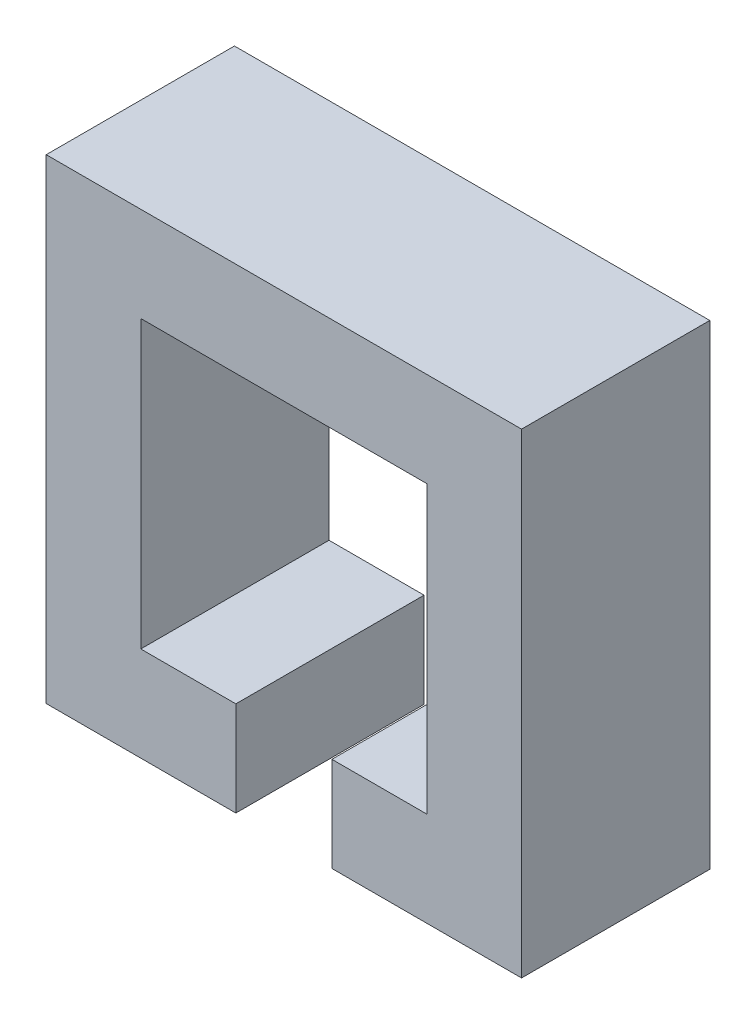
ISO-10303-21;
HEADER;
FILE_DESCRIPTION(('STEP AP214'),'2;1');
FILE_NAME('part.step','',(''),(''),'','','');
FILE_SCHEMA(('AUTOMOTIVE_DESIGN { 1 0 10303 214 1 1 1 1 }'));
ENDSEC;
DATA;
#1=APPLICATION_CONTEXT('core data for automotive mechanical design processes');
#2=APPLICATION_PROTOCOL_DEFINITION('international standard','automotive_design',2000,#1);
#3=PRODUCT_CONTEXT('',#1,'mechanical');
#4=PRODUCT('Part','Part','',(#3));
#5=PRODUCT_RELATED_PRODUCT_CATEGORY('part','',(#4));
#6=PRODUCT_DEFINITION_FORMATION('','',#4);
#7=PRODUCT_DEFINITION_CONTEXT('part definition',#1,'design');
#8=PRODUCT_DEFINITION('design','',#6,#7);
#9=PRODUCT_DEFINITION_SHAPE('','',#8);
#10=(LENGTH_UNIT() NAMED_UNIT(*) SI_UNIT(.MILLI.,.METRE.));
#11=(NAMED_UNIT(*) PLANE_ANGLE_UNIT() SI_UNIT($,.RADIAN.));
#12=(NAMED_UNIT(*) SI_UNIT($,.STERADIAN.) SOLID_ANGLE_UNIT());
#13=UNCERTAINTY_MEASURE_WITH_UNIT(LENGTH_MEASURE(1.E-05),#10,'distance_accuracy_value','');
#14=(GEOMETRIC_REPRESENTATION_CONTEXT(3) GLOBAL_UNCERTAINTY_ASSIGNED_CONTEXT((#13)) GLOBAL_UNIT_ASSIGNED_CONTEXT((#10,
#11,#12)) REPRESENTATION_CONTEXT('',''));
#15=CARTESIAN_POINT('',(0.,0.,0.));
#16=DIRECTION('',(0.,0.,1.));
#17=DIRECTION('',(1.,0.,0.));
#18=AXIS2_PLACEMENT_3D('',#15,#16,#17);
#19=CARTESIAN_POINT('',(-2.5259998716265,-25.0259988006056,0.));
#20=DIRECTION('',(0.,1.,0.));
#21=DIRECTION('',(0.,0.,1.));
#22=AXIS2_PLACEMENT_3D('',#19,#20,#21);
#23=PLANE('',#22);
#24=DIRECTION('',(-1.,0.,0.));
#25=VECTOR('',#24,1.);
#26=CARTESIAN_POINT('',(-2.5259998716265,-25.0259988006056,9.89999994635582));
#27=LINE('',#26,#25);
#28=CARTESIAN_POINT('',(-2.5259998716265,-25.0259988006056,9.89999994635582));
#29=VERTEX_POINT('',#28);
#30=CARTESIAN_POINT('',(-7.52599991819263,-25.0259988006056,9.89999994635582));
#31=VERTEX_POINT('',#30);
#32=EDGE_CURVE('E170',#29,#31,#27,.T.);
#33=ORIENTED_EDGE('',*,*,#32,.F.);
#34=DIRECTION('',(0.,0.,1.));
#35=VECTOR('',#34,1.);
#36=CARTESIAN_POINT('',(-2.5259998716265,-25.0259988006056,0.));
#37=LINE('',#36,#35);
#38=CARTESIAN_POINT('',(-2.5259998716265,-25.0259988006056,0.));
#39=VERTEX_POINT('',#38);
#40=EDGE_CURVE('E11',#39,#29,#37,.T.);
#41=ORIENTED_EDGE('',*,*,#40,.F.);
#42=DIRECTION('',(-1.,0.,0.));
#43=VECTOR('',#42,1.);
#44=CARTESIAN_POINT('',(-2.5259998716265,-25.0259988006056,0.));
#45=LINE('',#44,#43);
#46=CARTESIAN_POINT('',(-7.52599991819263,-25.0259988006056,0.));
#47=VERTEX_POINT('',#46);
#48=EDGE_CURVE('E214',#39,#47,#45,.T.);
#49=ORIENTED_EDGE('',*,*,#48,.T.);
#50=DIRECTION('',(0.,0.,1.));
#51=VECTOR('',#50,1.);
#52=CARTESIAN_POINT('',(-7.52599991819263,-25.0259988006056,0.));
#53=LINE('',#52,#51);
#54=EDGE_CURVE('E46',#47,#31,#53,.T.);
#55=ORIENTED_EDGE('',*,*,#54,.T.);
#56=EDGE_LOOP('',(#33,#41,#49,#55));
#57=FACE_BOUND('',#56,.T.);
#58=ADVANCED_FACE('F43',(#57),#23,.T.);
#59=CARTESIAN_POINT('',(-2.5259998716265,-29.9999988824129,0.));
#60=DIRECTION('',(1.,0.,0.));
#61=DIRECTION('',(0.,0.,-1.));
#62=AXIS2_PLACEMENT_3D('',#59,#60,#61);
#63=PLANE('',#62);
#64=DIRECTION('',(0.,1.,0.));
#65=VECTOR('',#64,1.);
#66=CARTESIAN_POINT('',(-2.5259998716265,-29.9999988824129,9.89999994635582));
#67=LINE('',#66,#65);
#68=CARTESIAN_POINT('',(-2.5259998716265,-29.9999988824129,9.89999994635582));
#69=VERTEX_POINT('',#68);
#70=EDGE_CURVE('E211',#69,#29,#67,.T.);
#71=ORIENTED_EDGE('',*,*,#70,.F.);
#72=DIRECTION('',(0.,0.,1.));
#73=VECTOR('',#72,1.);
#74=CARTESIAN_POINT('',(-2.5259998716265,-29.9999988824129,0.));
#75=LINE('',#74,#73);
#76=CARTESIAN_POINT('',(-2.5259998716265,-29.9999988824129,0.));
#77=VERTEX_POINT('',#76);
#78=EDGE_CURVE('E53',#77,#69,#75,.T.);
#79=ORIENTED_EDGE('',*,*,#78,.F.);
#80=DIRECTION('',(0.,1.,0.));
#81=VECTOR('',#80,1.);
#82=CARTESIAN_POINT('',(-2.5259998716265,-29.9999988824129,0.));
#83=LINE('',#82,#81);
#84=EDGE_CURVE('E156',#77,#39,#83,.T.);
#85=ORIENTED_EDGE('',*,*,#84,.T.);
#86=ORIENTED_EDGE('',*,*,#40,.T.);
#87=EDGE_LOOP('',(#71,#79,#85,#86));
#88=FACE_BOUND('',#87,.T.);
#89=ADVANCED_FACE('F244',(#88),#63,.T.);
#90=CARTESIAN_POINT('',(-12.5,-29.9999988824129,0.));
#91=DIRECTION('',(0.,-1.,0.));
#92=DIRECTION('',(0.,0.,-1.));
#93=AXIS2_PLACEMENT_3D('',#90,#91,#92);
#94=PLANE('',#93);
#95=DIRECTION('',(1.,0.,0.));
#96=VECTOR('',#95,1.);
#97=CARTESIAN_POINT('',(-12.5,-29.9999988824129,9.89999994635582));
#98=LINE('',#97,#96);
#99=CARTESIAN_POINT('',(-12.5,-29.9999988824129,9.89999994635582));
#100=VERTEX_POINT('',#99);
#101=EDGE_CURVE('E142',#100,#69,#98,.T.);
#102=ORIENTED_EDGE('',*,*,#101,.F.);
#103=DIRECTION('',(0.,0.,1.));
#104=VECTOR('',#103,1.);
#105=CARTESIAN_POINT('',(-12.5,-29.9999988824129,0.));
#106=LINE('',#105,#104);
#107=CARTESIAN_POINT('',(-12.5,-29.9999988824129,0.));
#108=VERTEX_POINT('',#107);
#109=EDGE_CURVE('E137',#108,#100,#106,.T.);
#110=ORIENTED_EDGE('',*,*,#109,.F.);
#111=DIRECTION('',(1.,0.,0.));
#112=VECTOR('',#111,1.);
#113=CARTESIAN_POINT('',(-12.5,-29.9999988824129,0.));
#114=LINE('',#113,#112);
#115=EDGE_CURVE('E140',#108,#77,#114,.T.);
#116=ORIENTED_EDGE('',*,*,#115,.T.);
#117=ORIENTED_EDGE('',*,*,#78,.T.);
#118=EDGE_LOOP('',(#102,#110,#116,#117));
#119=FACE_BOUND('',#118,.T.);
#120=ADVANCED_FACE('F139',(#119),#94,.T.);
#121=CARTESIAN_POINT('',(-12.5,-4.99999981373549,0.));
#122=DIRECTION('',(-1.,0.,0.));
#123=DIRECTION('',(0.,0.,1.));
#124=AXIS2_PLACEMENT_3D('',#121,#122,#123);
#125=PLANE('',#124);
#126=DIRECTION('',(0.,-1.,0.));
#127=VECTOR('',#126,1.);
#128=CARTESIAN_POINT('',(-12.5,-4.99999981373549,9.89999994635582));
#129=LINE('',#128,#127);
#130=CARTESIAN_POINT('',(-12.5,-4.99999981373549,9.89999994635582));
#131=VERTEX_POINT('',#130);
#132=EDGE_CURVE('E206',#131,#100,#129,.T.);
#133=ORIENTED_EDGE('',*,*,#132,.F.);
#134=DIRECTION('',(0.,0.,1.));
#135=VECTOR('',#134,1.);
#136=CARTESIAN_POINT('',(-12.5,-4.99999981373549,0.));
#137=LINE('',#136,#135);
#138=CARTESIAN_POINT('',(-12.5,-4.99999981373549,0.));
#139=VERTEX_POINT('',#138);
#140=EDGE_CURVE('E148',#139,#131,#137,.T.);
#141=ORIENTED_EDGE('',*,*,#140,.F.);
#142=DIRECTION('',(0.,-1.,0.));
#143=VECTOR('',#142,1.);
#144=CARTESIAN_POINT('',(-12.5,-4.99999981373549,0.));
#145=LINE('',#144,#143);
#146=EDGE_CURVE('E154',#139,#108,#145,.T.);
#147=ORIENTED_EDGE('',*,*,#146,.T.);
#148=ORIENTED_EDGE('',*,*,#109,.T.);
#149=EDGE_LOOP('',(#133,#141,#147,#148));
#150=FACE_BOUND('',#149,.T.);
#151=ADVANCED_FACE('F159',(#150),#125,.T.);
#152=CARTESIAN_POINT('',(12.5,-4.99999981373549,0.));
#153=DIRECTION('',(0.,1.,0.));
#154=DIRECTION('',(0.,0.,1.));
#155=AXIS2_PLACEMENT_3D('',#152,#153,#154);
#156=PLANE('',#155);
#157=DIRECTION('',(-1.,0.,0.));
#158=VECTOR('',#157,1.);
#159=CARTESIAN_POINT('',(12.5,-4.99999981373549,9.89999994635582));
#160=LINE('',#159,#158);
#161=CARTESIAN_POINT('',(12.5,-4.99999981373549,9.89999994635582));
#162=VERTEX_POINT('',#161);
#163=EDGE_CURVE('E202',#162,#131,#160,.T.);
#164=ORIENTED_EDGE('',*,*,#163,.F.);
#165=DIRECTION('',(0.,0.,1.));
#166=VECTOR('',#165,1.);
#167=CARTESIAN_POINT('',(12.5,-4.99999981373549,0.));
#168=LINE('',#167,#166);
#169=CARTESIAN_POINT('',(12.5,-4.99999981373549,0.));
#170=VERTEX_POINT('',#169);
#171=EDGE_CURVE('E220',#170,#162,#168,.T.);
#172=ORIENTED_EDGE('',*,*,#171,.F.);
#173=DIRECTION('',(-1.,0.,0.));
#174=VECTOR('',#173,1.);
#175=CARTESIAN_POINT('',(12.5,-4.99999981373549,0.));
#176=LINE('',#175,#174);
#177=EDGE_CURVE('E161',#170,#139,#176,.T.);
#178=ORIENTED_EDGE('',*,*,#177,.T.);
#179=ORIENTED_EDGE('',*,*,#140,.T.);
#180=EDGE_LOOP('',(#164,#172,#178,#179));
#181=FACE_BOUND('',#180,.T.);
#182=ADVANCED_FACE('F257',(#181),#156,.T.);
#183=CARTESIAN_POINT('',(12.5,-29.9999988824129,0.));
#184=DIRECTION('',(1.,0.,0.));
#185=DIRECTION('',(0.,0.,-1.));
#186=AXIS2_PLACEMENT_3D('',#183,#184,#185);
#187=PLANE('',#186);
#188=DIRECTION('',(0.,1.,0.));
#189=VECTOR('',#188,1.);
#190=CARTESIAN_POINT('',(12.5,-29.9999988824129,9.89999994635582));
#191=LINE('',#190,#189);
#192=CARTESIAN_POINT('',(12.5,-29.9999988824129,9.89999994635582));
#193=VERTEX_POINT('',#192);
#194=EDGE_CURVE('E198',#193,#162,#191,.T.);
#195=ORIENTED_EDGE('',*,*,#194,.F.);
#196=DIRECTION('',(0.,0.,1.));
#197=VECTOR('',#196,1.);
#198=CARTESIAN_POINT('',(12.5,-29.9999988824129,0.));
#199=LINE('',#198,#197);
#200=CARTESIAN_POINT('',(12.5,-29.9999988824129,0.));
#201=VERTEX_POINT('',#200);
#202=EDGE_CURVE('E223',#201,#193,#199,.T.);
#203=ORIENTED_EDGE('',*,*,#202,.F.);
#204=DIRECTION('',(0.,1.,0.));
#205=VECTOR('',#204,1.);
#206=CARTESIAN_POINT('',(12.5,-29.9999988824129,0.));
#207=LINE('',#206,#205);
#208=EDGE_CURVE('E164',#201,#170,#207,.T.);
#209=ORIENTED_EDGE('',*,*,#208,.T.);
#210=ORIENTED_EDGE('',*,*,#171,.T.);
#211=EDGE_LOOP('',(#195,#203,#209,#210));
#212=FACE_BOUND('',#211,.T.);
#213=ADVANCED_FACE('F260',(#212),#187,.T.);
#214=CARTESIAN_POINT('',(2.52649999184161,-29.9999988824129,0.));
#215=DIRECTION('',(0.,-1.,0.));
#216=DIRECTION('',(0.,0.,-1.));
#217=AXIS2_PLACEMENT_3D('',#214,#215,#216);
#218=PLANE('',#217);
#219=DIRECTION('',(1.,0.,0.));
#220=VECTOR('',#219,1.);
#221=CARTESIAN_POINT('',(2.52649999184161,-29.9999988824129,9.89999994635582));
#222=LINE('',#221,#220);
#223=CARTESIAN_POINT('',(2.52649999184161,-29.9999988824129,9.89999994635582));
#224=VERTEX_POINT('',#223);
#225=EDGE_CURVE('E194',#224,#193,#222,.T.);
#226=ORIENTED_EDGE('',*,*,#225,.F.);
#227=DIRECTION('',(0.,0.,1.));
#228=VECTOR('',#227,1.);
#229=CARTESIAN_POINT('',(2.52649999184161,-29.9999988824129,0.));
#230=LINE('',#229,#228);
#231=CARTESIAN_POINT('',(2.52649999184161,-29.9999988824129,0.));
#232=VERTEX_POINT('',#231);
#233=EDGE_CURVE('E226',#232,#224,#230,.T.);
#234=ORIENTED_EDGE('',*,*,#233,.F.);
#235=DIRECTION('',(1.,0.,0.));
#236=VECTOR('',#235,1.);
#237=CARTESIAN_POINT('',(2.52649999184161,-29.9999988824129,0.));
#238=LINE('',#237,#236);
#239=EDGE_CURVE('E414',#232,#201,#238,.T.);
#240=ORIENTED_EDGE('',*,*,#239,.T.);
#241=ORIENTED_EDGE('',*,*,#202,.T.);
#242=EDGE_LOOP('',(#226,#234,#240,#241));
#243=FACE_BOUND('',#242,.T.);
#244=ADVANCED_FACE('F264',(#243),#218,.T.);
#245=CARTESIAN_POINT('',(2.52649999184161,-25.0259988006056,0.));
#246=DIRECTION('',(-1.,0.,0.));
#247=DIRECTION('',(0.,0.,1.));
#248=AXIS2_PLACEMENT_3D('',#245,#246,#247);
#249=PLANE('',#248);
#250=DIRECTION('',(0.,-1.,0.));
#251=VECTOR('',#250,1.);
#252=CARTESIAN_POINT('',(2.52649999184161,-25.0259988006056,9.89999994635582));
#253=LINE('',#252,#251);
#254=CARTESIAN_POINT('',(2.52649999184161,-25.0259988006056,9.89999994635582));
#255=VERTEX_POINT('',#254);
#256=EDGE_CURVE('E190',#255,#224,#253,.T.);
#257=ORIENTED_EDGE('',*,*,#256,.F.);
#258=DIRECTION('',(0.,0.,1.));
#259=VECTOR('',#258,1.);
#260=CARTESIAN_POINT('',(2.52649999184161,-25.0259988006056,0.));
#261=LINE('',#260,#259);
#262=CARTESIAN_POINT('',(2.52649999184161,-25.0259988006056,0.));
#263=VERTEX_POINT('',#262);
#264=EDGE_CURVE('E229',#263,#255,#261,.T.);
#265=ORIENTED_EDGE('',*,*,#264,.F.);
#266=DIRECTION('',(0.,-1.,0.));
#267=VECTOR('',#266,1.);
#268=CARTESIAN_POINT('',(2.52649999184161,-25.0259988006056,0.));
#269=LINE('',#268,#267);
#270=EDGE_CURVE('E420',#263,#232,#269,.T.);
#271=ORIENTED_EDGE('',*,*,#270,.T.);
#272=ORIENTED_EDGE('',*,*,#233,.T.);
#273=EDGE_LOOP('',(#257,#265,#271,#272));
#274=FACE_BOUND('',#273,.T.);
#275=ADVANCED_FACE('F268',(#274),#249,.T.);
#276=CARTESIAN_POINT('',(7.52650003840774,-25.0259988006056,0.));
#277=DIRECTION('',(0.,1.,0.));
#278=DIRECTION('',(0.,0.,1.));
#279=AXIS2_PLACEMENT_3D('',#276,#277,#278);
#280=PLANE('',#279);
#281=DIRECTION('',(-1.,0.,0.));
#282=VECTOR('',#281,1.);
#283=CARTESIAN_POINT('',(7.52650003840774,-25.0259988006056,9.89999994635582));
#284=LINE('',#283,#282);
#285=CARTESIAN_POINT('',(7.52650003840774,-25.0259988006056,9.89999994635582));
#286=VERTEX_POINT('',#285);
#287=EDGE_CURVE('E186',#286,#255,#284,.T.);
#288=ORIENTED_EDGE('',*,*,#287,.F.);
#289=DIRECTION('',(0.,0.,1.));
#290=VECTOR('',#289,1.);
#291=CARTESIAN_POINT('',(7.52650003840774,-25.0259988006056,0.));
#292=LINE('',#291,#290);
#293=CARTESIAN_POINT('',(7.52650003840774,-25.0259988006056,0.));
#294=VERTEX_POINT('',#293);
#295=EDGE_CURVE('E232',#294,#286,#292,.T.);
#296=ORIENTED_EDGE('',*,*,#295,.F.);
#297=DIRECTION('',(-1.,0.,0.));
#298=VECTOR('',#297,1.);
#299=CARTESIAN_POINT('',(7.52650003840774,-25.0259988006056,0.));
#300=LINE('',#299,#298);
#301=EDGE_CURVE('E407',#294,#263,#300,.T.);
#302=ORIENTED_EDGE('',*,*,#301,.T.);
#303=ORIENTED_EDGE('',*,*,#264,.T.);
#304=EDGE_LOOP('',(#288,#296,#302,#303));
#305=FACE_BOUND('',#304,.T.);
#306=ADVANCED_FACE('F272',(#305),#280,.T.);
#307=CARTESIAN_POINT('',(7.52650003840774,-9.97399989554286,0.));
#308=DIRECTION('',(-1.,0.,0.));
#309=DIRECTION('',(0.,0.,1.));
#310=AXIS2_PLACEMENT_3D('',#307,#308,#309);
#311=PLANE('',#310);
#312=DIRECTION('',(0.,-1.,0.));
#313=VECTOR('',#312,1.);
#314=CARTESIAN_POINT('',(7.52650003840774,-9.97399989554286,9.89999994635582));
#315=LINE('',#314,#313);
#316=CARTESIAN_POINT('',(7.52650003840774,-9.97399989554286,9.89999994635582));
#317=VERTEX_POINT('',#316);
#318=EDGE_CURVE('E182',#317,#286,#315,.T.);
#319=ORIENTED_EDGE('',*,*,#318,.F.);
#320=DIRECTION('',(0.,0.,1.));
#321=VECTOR('',#320,1.);
#322=CARTESIAN_POINT('',(7.52650003840774,-9.97399989554286,0.));
#323=LINE('',#322,#321);
#324=CARTESIAN_POINT('',(7.52650003840774,-9.97399989554286,0.));
#325=VERTEX_POINT('',#324);
#326=EDGE_CURVE('E235',#325,#317,#323,.T.);
#327=ORIENTED_EDGE('',*,*,#326,.F.);
#328=DIRECTION('',(0.,-1.,0.));
#329=VECTOR('',#328,1.);
#330=CARTESIAN_POINT('',(7.52650003840774,-9.97399989554286,0.));
#331=LINE('',#330,#329);
#332=EDGE_CURVE('E403',#325,#294,#331,.T.);
#333=ORIENTED_EDGE('',*,*,#332,.T.);
#334=ORIENTED_EDGE('',*,*,#295,.T.);
#335=EDGE_LOOP('',(#319,#327,#333,#334));
#336=FACE_BOUND('',#335,.T.);
#337=ADVANCED_FACE('F276',(#336),#311,.T.);
#338=CARTESIAN_POINT('',(-7.52599991819263,-9.97399989554286,0.));
#339=DIRECTION('',(0.,-1.,0.));
#340=DIRECTION('',(0.,0.,-1.));
#341=AXIS2_PLACEMENT_3D('',#338,#339,#340);
#342=PLANE('',#341);
#343=DIRECTION('',(1.,0.,0.));
#344=VECTOR('',#343,1.);
#345=CARTESIAN_POINT('',(-7.52599991819263,-9.97399989554286,9.89999994635582));
#346=LINE('',#345,#344);
#347=CARTESIAN_POINT('',(-7.52599991819263,-9.97399989554286,9.89999994635582));
#348=VERTEX_POINT('',#347);
#349=EDGE_CURVE('E178',#348,#317,#346,.T.);
#350=ORIENTED_EDGE('',*,*,#349,.F.);
#351=DIRECTION('',(0.,0.,1.));
#352=VECTOR('',#351,1.);
#353=CARTESIAN_POINT('',(-7.52599991819263,-9.97399989554286,0.));
#354=LINE('',#353,#352);
#355=CARTESIAN_POINT('',(-7.52599991819263,-9.97399989554286,0.));
#356=VERTEX_POINT('',#355);
#357=EDGE_CURVE('E237',#356,#348,#354,.T.);
#358=ORIENTED_EDGE('',*,*,#357,.F.);
#359=DIRECTION('',(1.,0.,0.));
#360=VECTOR('',#359,1.);
#361=CARTESIAN_POINT('',(-7.52599991819263,-9.97399989554286,0.));
#362=LINE('',#361,#360);
#363=EDGE_CURVE('E429',#356,#325,#362,.T.);
#364=ORIENTED_EDGE('',*,*,#363,.T.);
#365=ORIENTED_EDGE('',*,*,#326,.T.);
#366=EDGE_LOOP('',(#350,#358,#364,#365));
#367=FACE_BOUND('',#366,.T.);
#368=ADVANCED_FACE('F280',(#367),#342,.T.);
#369=CARTESIAN_POINT('',(-7.52599991819263,-25.0259988006056,0.));
#370=DIRECTION('',(1.,0.,0.));
#371=DIRECTION('',(0.,1.,0.));
#372=AXIS2_PLACEMENT_3D('',#369,#370,#371);
#373=PLANE('',#372);
#374=DIRECTION('',(0.,1.,0.));
#375=VECTOR('',#374,1.);
#376=CARTESIAN_POINT('',(-7.52599991819263,-25.0259988006056,9.89999994635582));
#377=LINE('',#376,#375);
#378=EDGE_CURVE('E174',#31,#348,#377,.T.);
#379=ORIENTED_EDGE('',*,*,#378,.F.);
#380=ORIENTED_EDGE('',*,*,#54,.F.);
#381=DIRECTION('',(0.,1.,0.));
#382=VECTOR('',#381,1.);
#383=CARTESIAN_POINT('',(-7.52599991819263,-25.0259988006056,0.));
#384=LINE('',#383,#382);
#385=EDGE_CURVE('E432',#47,#356,#384,.T.);
#386=ORIENTED_EDGE('',*,*,#385,.T.);
#387=ORIENTED_EDGE('',*,*,#357,.T.);
#388=EDGE_LOOP('',(#379,#380,#386,#387));
#389=FACE_BOUND('',#388,.T.);
#390=ADVANCED_FACE('F241',(#389),#373,.T.);
#391=CARTESIAN_POINT('',(0.,0.,0.));
#392=DIRECTION('',(0.,0.,-1.));
#393=DIRECTION('',(-1.,0.,0.));
#394=AXIS2_PLACEMENT_3D('',#391,#392,#393);
#395=PLANE('',#394);
#396=ORIENTED_EDGE('',*,*,#48,.F.);
#397=ORIENTED_EDGE('',*,*,#84,.F.);
#398=ORIENTED_EDGE('',*,*,#115,.F.);
#399=ORIENTED_EDGE('',*,*,#146,.F.);
#400=ORIENTED_EDGE('',*,*,#177,.F.);
#401=ORIENTED_EDGE('',*,*,#208,.F.);
#402=ORIENTED_EDGE('',*,*,#239,.F.);
#403=ORIENTED_EDGE('',*,*,#270,.F.);
#404=ORIENTED_EDGE('',*,*,#301,.F.);
#405=ORIENTED_EDGE('',*,*,#332,.F.);
#406=ORIENTED_EDGE('',*,*,#363,.F.);
#407=ORIENTED_EDGE('',*,*,#385,.F.);
#408=EDGE_LOOP('',(#396,#397,#398,#399,#400,#401,#402,#403,#404,#405,#406,#407));
#409=FACE_BOUND('',#408,.T.);
#410=ADVANCED_FACE('F152',(#409),#395,.T.);
#411=CARTESIAN_POINT('',(0.,0.,9.89999994635582));
#412=DIRECTION('',(0.,0.,-1.));
#413=DIRECTION('',(-1.,0.,0.));
#414=AXIS2_PLACEMENT_3D('',#411,#412,#413);
#415=PLANE('',#414);
#416=ORIENTED_EDGE('',*,*,#32,.T.);
#417=ORIENTED_EDGE('',*,*,#378,.T.);
#418=ORIENTED_EDGE('',*,*,#349,.T.);
#419=ORIENTED_EDGE('',*,*,#318,.T.);
#420=ORIENTED_EDGE('',*,*,#287,.T.);
#421=ORIENTED_EDGE('',*,*,#256,.T.);
#422=ORIENTED_EDGE('',*,*,#225,.T.);
#423=ORIENTED_EDGE('',*,*,#194,.T.);
#424=ORIENTED_EDGE('',*,*,#163,.T.);
#425=ORIENTED_EDGE('',*,*,#132,.T.);
#426=ORIENTED_EDGE('',*,*,#101,.T.);
#427=ORIENTED_EDGE('',*,*,#70,.T.);
#428=EDGE_LOOP('',(#416,#417,#418,#419,#420,#421,#422,#423,#424,#425,#426,#427));
#429=FACE_BOUND('',#428,.T.);
#430=ADVANCED_FACE('F243',(#429),#415,.F.);
#431=CLOSED_SHELL('',(#58,#89,#120,#151,#182,#213,#244,#275,#306,#337,#368,#390,#410,#430));
#432=MANIFOLD_SOLID_BREP('B2',#431);
#433=ADVANCED_BREP_SHAPE_REPRESENTATION('',(#18,#432),#14);
#434=SHAPE_DEFINITION_REPRESENTATION(#9,#433);
ENDSEC;
END-ISO-10303-21;
